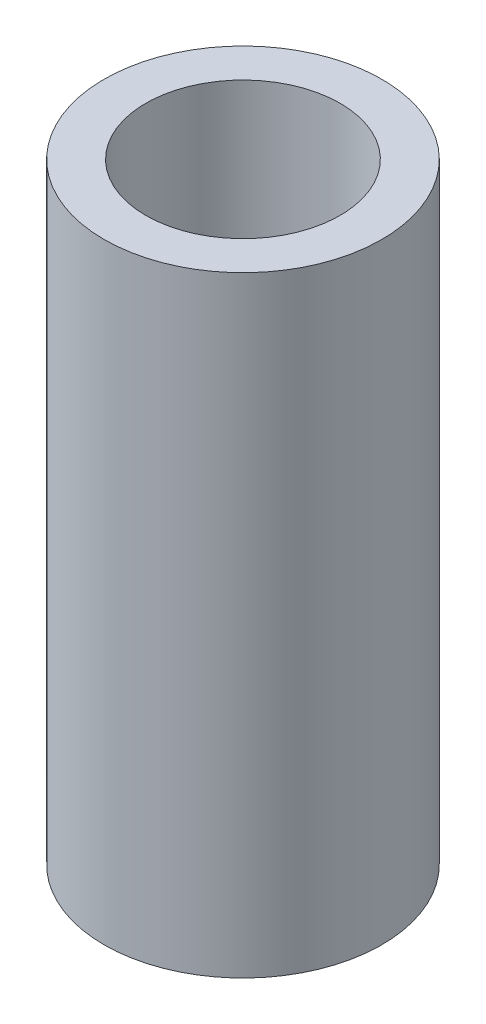
ISO-10303-21;
HEADER;
FILE_DESCRIPTION(('STEP AP214'),'2;1');
FILE_NAME('part.step','',(''),(''),'','','');
FILE_SCHEMA(('AUTOMOTIVE_DESIGN { 1 0 10303 214 1 1 1 1 }'));
ENDSEC;
DATA;
#1=APPLICATION_CONTEXT('core data for automotive mechanical design processes');
#2=APPLICATION_PROTOCOL_DEFINITION('international standard','automotive_design',2000,#1);
#3=PRODUCT_CONTEXT('',#1,'mechanical');
#4=PRODUCT('Part','Part','',(#3));
#5=PRODUCT_RELATED_PRODUCT_CATEGORY('part','',(#4));
#6=PRODUCT_DEFINITION_FORMATION('','',#4);
#7=PRODUCT_DEFINITION_CONTEXT('part definition',#1,'design');
#8=PRODUCT_DEFINITION('design','',#6,#7);
#9=PRODUCT_DEFINITION_SHAPE('','',#8);
#10=(LENGTH_UNIT() NAMED_UNIT(*) SI_UNIT(.MILLI.,.METRE.));
#11=(NAMED_UNIT(*) PLANE_ANGLE_UNIT() SI_UNIT($,.RADIAN.));
#12=(NAMED_UNIT(*) SI_UNIT($,.STERADIAN.) SOLID_ANGLE_UNIT());
#13=UNCERTAINTY_MEASURE_WITH_UNIT(LENGTH_MEASURE(1.E-05),#10,'distance_accuracy_value','');
#14=(GEOMETRIC_REPRESENTATION_CONTEXT(3) GLOBAL_UNCERTAINTY_ASSIGNED_CONTEXT((#13)) GLOBAL_UNIT_ASSIGNED_CONTEXT((#10,
#11,#12)) REPRESENTATION_CONTEXT('',''));
#15=CARTESIAN_POINT('',(0.,0.,0.));
#16=DIRECTION('',(0.,0.,1.));
#17=DIRECTION('',(1.,0.,0.));
#18=AXIS2_PLACEMENT_3D('',#15,#16,#17);
#19=CARTESIAN_POINT('',(0.,11.,0.));
#20=DIRECTION('',(0.,1.,0.));
#21=DIRECTION('',(0.,0.,1.));
#22=AXIS2_PLACEMENT_3D('',#19,#20,#21);
#23=PLANE('',#22);
#24=CARTESIAN_POINT('',(0.,11.,0.));
#25=DIRECTION('',(0.,1.,0.));
#26=DIRECTION('',(0.,0.,1.));
#27=AXIS2_PLACEMENT_3D('',#24,#25,#26);
#28=CIRCLE('',#27,2.5);
#29=CARTESIAN_POINT('',(0.,11.,2.5));
#30=VERTEX_POINT('',#29);
#31=EDGE_CURVE('E10',#30,#30,#28,.T.);
#32=ORIENTED_EDGE('',*,*,#31,.T.);
#33=EDGE_LOOP('',(#32));
#34=FACE_BOUND('',#33,.T.);
#35=CARTESIAN_POINT('',(0.,11.,0.));
#36=DIRECTION('',(0.,1.,0.));
#37=DIRECTION('',(0.,0.,1.));
#38=AXIS2_PLACEMENT_3D('',#35,#36,#37);
#39=CIRCLE('',#38,1.75);
#40=CARTESIAN_POINT('',(0.,11.,1.75));
#41=VERTEX_POINT('',#40);
#42=EDGE_CURVE('E41',#41,#41,#39,.T.);
#43=ORIENTED_EDGE('',*,*,#42,.F.);
#44=EDGE_LOOP('',(#43));
#45=FACE_BOUND('',#44,.T.);
#46=ADVANCED_FACE('F30',(#34,#45),#23,.T.);
#47=CARTESIAN_POINT('',(0.,0.,0.));
#48=DIRECTION('',(0.,1.,0.));
#49=DIRECTION('',(0.,0.,1.));
#50=AXIS2_PLACEMENT_3D('',#47,#48,#49);
#51=PLANE('',#50);
#52=CARTESIAN_POINT('',(0.,0.,0.));
#53=DIRECTION('',(0.,1.,0.));
#54=DIRECTION('',(0.,0.,1.));
#55=AXIS2_PLACEMENT_3D('',#52,#53,#54);
#56=CIRCLE('',#55,2.5);
#57=CARTESIAN_POINT('',(0.,0.,2.5));
#58=VERTEX_POINT('',#57);
#59=EDGE_CURVE('E34',#58,#58,#56,.T.);
#60=ORIENTED_EDGE('',*,*,#59,.F.);
#61=EDGE_LOOP('',(#60));
#62=FACE_BOUND('',#61,.T.);
#63=CARTESIAN_POINT('',(0.,0.,0.));
#64=DIRECTION('',(0.,1.,0.));
#65=DIRECTION('',(0.,0.,1.));
#66=AXIS2_PLACEMENT_3D('',#63,#64,#65);
#67=CIRCLE('',#66,1.75);
#68=CARTESIAN_POINT('',(0.,0.,1.75));
#69=VERTEX_POINT('',#68);
#70=EDGE_CURVE('E43',#69,#69,#67,.T.);
#71=ORIENTED_EDGE('',*,*,#70,.T.);
#72=EDGE_LOOP('',(#71));
#73=FACE_BOUND('',#72,.T.);
#74=ADVANCED_FACE('F53',(#62,#73),#51,.F.);
#75=CARTESIAN_POINT('',(0.,11.,0.));
#76=DIRECTION('',(0.,-1.,0.));
#77=DIRECTION('',(0.,0.,-1.));
#78=AXIS2_PLACEMENT_3D('',#75,#76,#77);
#79=CYLINDRICAL_SURFACE('',#78,2.5);
#80=ORIENTED_EDGE('',*,*,#31,.F.);
#81=EDGE_LOOP('',(#80));
#82=FACE_BOUND('',#81,.T.);
#83=ORIENTED_EDGE('',*,*,#59,.T.);
#84=EDGE_LOOP('',(#83));
#85=FACE_BOUND('',#84,.T.);
#86=ADVANCED_FACE('F32',(#82,#85),#79,.T.);
#87=CARTESIAN_POINT('',(0.,11.,0.));
#88=DIRECTION('',(0.,-1.,0.));
#89=DIRECTION('',(0.,0.,-1.));
#90=AXIS2_PLACEMENT_3D('',#87,#88,#89);
#91=CYLINDRICAL_SURFACE('',#90,1.75);
#92=ORIENTED_EDGE('',*,*,#42,.T.);
#93=EDGE_LOOP('',(#92));
#94=FACE_BOUND('',#93,.T.);
#95=ORIENTED_EDGE('',*,*,#70,.F.);
#96=EDGE_LOOP('',(#95));
#97=FACE_BOUND('',#96,.T.);
#98=ADVANCED_FACE('F49',(#94,#97),#91,.F.);
#99=CLOSED_SHELL('',(#46,#74,#86,#98));
#100=MANIFOLD_SOLID_BREP('B2',#99);
#101=ADVANCED_BREP_SHAPE_REPRESENTATION('',(#18,#100),#14);
#102=SHAPE_DEFINITION_REPRESENTATION(#9,#101);
ENDSEC;
END-ISO-10303-21;
